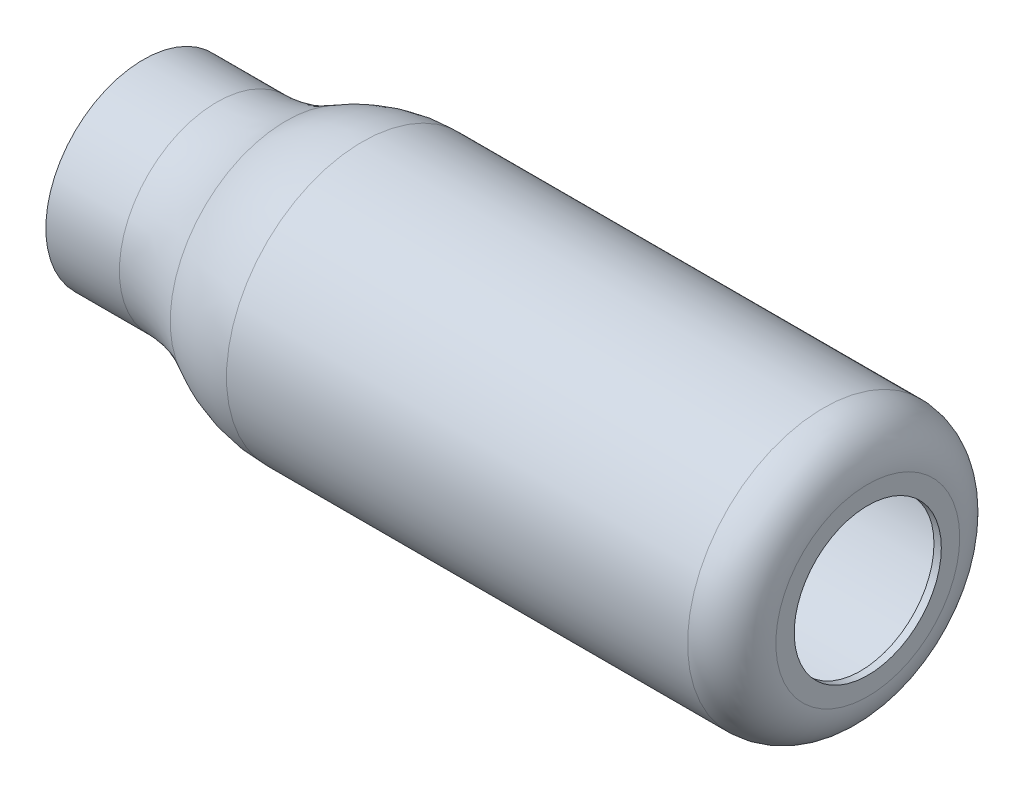
ISO-10303-21;
HEADER;
FILE_DESCRIPTION(('STEP AP214'),'2;1');
FILE_NAME('part.step','',(''),(''),'','','');
FILE_SCHEMA(('AUTOMOTIVE_DESIGN { 1 0 10303 214 1 1 1 1 }'));
ENDSEC;
DATA;
#1=APPLICATION_CONTEXT('core data for automotive mechanical design processes');
#2=APPLICATION_PROTOCOL_DEFINITION('international standard','automotive_design',2000,#1);
#3=PRODUCT_CONTEXT('',#1,'mechanical');
#4=PRODUCT('Part','Part','',(#3));
#5=PRODUCT_RELATED_PRODUCT_CATEGORY('part','',(#4));
#6=PRODUCT_DEFINITION_FORMATION('','',#4);
#7=PRODUCT_DEFINITION_CONTEXT('part definition',#1,'design');
#8=PRODUCT_DEFINITION('design','',#6,#7);
#9=PRODUCT_DEFINITION_SHAPE('','',#8);
#10=(LENGTH_UNIT() NAMED_UNIT(*) SI_UNIT(.MILLI.,.METRE.));
#11=(NAMED_UNIT(*) PLANE_ANGLE_UNIT() SI_UNIT($,.RADIAN.));
#12=(NAMED_UNIT(*) SI_UNIT($,.STERADIAN.) SOLID_ANGLE_UNIT());
#13=UNCERTAINTY_MEASURE_WITH_UNIT(LENGTH_MEASURE(1.E-05),#10,'distance_accuracy_value','');
#14=(GEOMETRIC_REPRESENTATION_CONTEXT(3) GLOBAL_UNCERTAINTY_ASSIGNED_CONTEXT((#13)) GLOBAL_UNIT_ASSIGNED_CONTEXT((#10,
#11,#12)) REPRESENTATION_CONTEXT('',''));
#15=CARTESIAN_POINT('',(0.,0.,0.));
#16=DIRECTION('',(0.,0.,1.));
#17=DIRECTION('',(1.,0.,0.));
#18=AXIS2_PLACEMENT_3D('',#15,#16,#17);
#19=CARTESIAN_POINT('',(0.,0.,0.));
#20=DIRECTION('',(1.,0.,0.));
#21=DIRECTION('',(0.,0.,-1.));
#22=AXIS2_PLACEMENT_3D('',#19,#20,#21);
#23=CYLINDRICAL_SURFACE('',#22,16.8275);
#24=CARTESIAN_POINT('',(-123.825,0.,0.));
#25=DIRECTION('',(1.,0.,0.));
#26=DIRECTION('',(0.,0.,-1.));
#27=AXIS2_PLACEMENT_3D('',#24,#25,#26);
#28=CIRCLE('',#27,16.8275);
#29=CARTESIAN_POINT('',(-123.825,0.,-16.8275));
#30=VERTEX_POINT('',#29);
#31=EDGE_CURVE('E76',#30,#30,#28,.T.);
#32=ORIENTED_EDGE('',*,*,#31,.T.);
#33=EDGE_LOOP('',(#32));
#34=FACE_BOUND('',#33,.T.);
#35=CARTESIAN_POINT('',(-111.125,0.,0.));
#36=DIRECTION('',(1.,0.,0.));
#37=DIRECTION('',(0.,0.,-1.));
#38=AXIS2_PLACEMENT_3D('',#35,#36,#37);
#39=CIRCLE('',#38,16.8275);
#40=CARTESIAN_POINT('',(-111.125,0.,-16.8275));
#41=VERTEX_POINT('',#40);
#42=EDGE_CURVE('E10',#41,#41,#39,.T.);
#43=ORIENTED_EDGE('',*,*,#42,.F.);
#44=EDGE_LOOP('',(#43));
#45=FACE_BOUND('',#44,.T.);
#46=ADVANCED_FACE('F30',(#34,#45),#23,.T.);
#47=CARTESIAN_POINT('',(-111.125,0.,0.));
#48=DIRECTION('',(1.,0.,0.));
#49=DIRECTION('',(0.,0.,-1.));
#50=AXIS2_PLACEMENT_3D('',#47,#48,#49);
#51=TOROIDAL_SURFACE('',#50,40.9575,24.13);
#52=ORIENTED_EDGE('',*,*,#42,.T.);
#53=EDGE_LOOP('',(#52));
#54=FACE_BOUND('',#53,.T.);
#55=CARTESIAN_POINT('',(-99.1745961837646,0.,0.));
#56=DIRECTION('',(1.,0.,0.));
#57=DIRECTION('',(0.,0.,-1.));
#58=AXIS2_PLACEMENT_3D('',#55,#56,#57);
#59=CIRCLE('',#58,19.9945625);
#60=CARTESIAN_POINT('',(-99.1745961837646,0.,-19.9945625));
#61=VERTEX_POINT('',#60);
#62=EDGE_CURVE('E36',#61,#61,#59,.T.);
#63=ORIENTED_EDGE('',*,*,#62,.F.);
#64=EDGE_LOOP('',(#63));
#65=FACE_BOUND('',#64,.T.);
#66=ADVANCED_FACE('F142',(#54,#65),#51,.F.);
#67=CARTESIAN_POINT('',(-85.9662551237149,0.,0.));
#68=DIRECTION('',(1.,0.,0.));
#69=DIRECTION('',(0.,0.,-1.));
#70=AXIS2_PLACEMENT_3D('',#67,#68,#69);
#71=DEGENERATE_TOROIDAL_SURFACE('',#70,3.17500000000001,26.67,.F.);
#72=ORIENTED_EDGE('',*,*,#62,.T.);
#73=EDGE_LOOP('',(#72));
#74=FACE_BOUND('',#73,.T.);
#75=CARTESIAN_POINT('',(-85.9662551237149,0.,0.));
#76=DIRECTION('',(1.,0.,0.));
#77=DIRECTION('',(0.,0.,-1.));
#78=AXIS2_PLACEMENT_3D('',#75,#76,#77);
#79=CIRCLE('',#78,23.495);
#80=CARTESIAN_POINT('',(-85.9662551237149,0.,-23.495));
#81=VERTEX_POINT('',#80);
#82=EDGE_CURVE('E40',#81,#81,#79,.T.);
#83=ORIENTED_EDGE('',*,*,#82,.F.);
#84=EDGE_LOOP('',(#83));
#85=FACE_BOUND('',#84,.T.);
#86=ADVANCED_FACE('F146',(#74,#85),#71,.F.);
#87=CARTESIAN_POINT('',(0.,0.,0.));
#88=DIRECTION('',(1.,0.,0.));
#89=DIRECTION('',(0.,0.,-1.));
#90=AXIS2_PLACEMENT_3D('',#87,#88,#89);
#91=CYLINDRICAL_SURFACE('',#90,23.495);
#92=ORIENTED_EDGE('',*,*,#82,.T.);
#93=EDGE_LOOP('',(#92));
#94=FACE_BOUND('',#93,.T.);
#95=CARTESIAN_POINT('',(-6.35,0.,0.));
#96=DIRECTION('',(1.,0.,0.));
#97=DIRECTION('',(0.,0.,-1.));
#98=AXIS2_PLACEMENT_3D('',#95,#96,#97);
#99=CIRCLE('',#98,23.495);
#100=CARTESIAN_POINT('',(-6.35,0.,-23.495));
#101=VERTEX_POINT('',#100);
#102=EDGE_CURVE('E44',#101,#101,#99,.T.);
#103=ORIENTED_EDGE('',*,*,#102,.F.);
#104=EDGE_LOOP('',(#103));
#105=FACE_BOUND('',#104,.T.);
#106=ADVANCED_FACE('F138',(#94,#105),#91,.T.);
#107=CARTESIAN_POINT('',(-6.35,0.,0.));
#108=DIRECTION('',(1.,0.,0.));
#109=DIRECTION('',(0.,0.,-1.));
#110=AXIS2_PLACEMENT_3D('',#107,#108,#109);
#111=TOROIDAL_SURFACE('',#110,15.875,7.62);
#112=ORIENTED_EDGE('',*,*,#102,.T.);
#113=EDGE_LOOP('',(#112));
#114=FACE_BOUND('',#113,.T.);
#115=CARTESIAN_POINT('',(1.27,0.,0.));
#116=DIRECTION('',(1.,0.,0.));
#117=DIRECTION('',(0.,0.,-1.));
#118=AXIS2_PLACEMENT_3D('',#115,#116,#117);
#119=CIRCLE('',#118,15.875);
#120=CARTESIAN_POINT('',(1.27,0.,-15.875));
#121=VERTEX_POINT('',#120);
#122=EDGE_CURVE('E49',#121,#121,#119,.T.);
#123=ORIENTED_EDGE('',*,*,#122,.F.);
#124=EDGE_LOOP('',(#123));
#125=FACE_BOUND('',#124,.T.);
#126=ADVANCED_FACE('F132',(#114,#125),#111,.T.);
#127=CARTESIAN_POINT('',(1.27,12.7,0.));
#128=DIRECTION('',(1.,0.,0.));
#129=DIRECTION('',(0.,0.,-1.));
#130=AXIS2_PLACEMENT_3D('',#127,#128,#129);
#131=PLANE('',#130);
#132=ORIENTED_EDGE('',*,*,#122,.T.);
#133=EDGE_LOOP('',(#132));
#134=FACE_BOUND('',#133,.T.);
#135=CARTESIAN_POINT('',(1.27,0.,0.));
#136=DIRECTION('',(1.,0.,0.));
#137=DIRECTION('',(0.,0.,-1.));
#138=AXIS2_PLACEMENT_3D('',#135,#136,#137);
#139=CIRCLE('',#138,12.7);
#140=CARTESIAN_POINT('',(1.27,0.,-12.7));
#141=VERTEX_POINT('',#140);
#142=EDGE_CURVE('E52',#141,#141,#139,.T.);
#143=ORIENTED_EDGE('',*,*,#142,.F.);
#144=EDGE_LOOP('',(#143));
#145=FACE_BOUND('',#144,.T.);
#146=ADVANCED_FACE('F127',(#134,#145),#131,.T.);
#147=CARTESIAN_POINT('',(0.,0.,0.));
#148=DIRECTION('',(1.,0.,0.));
#149=DIRECTION('',(0.,0.,-1.));
#150=AXIS2_PLACEMENT_3D('',#147,#148,#149);
#151=CYLINDRICAL_SURFACE('',#150,12.7);
#152=CARTESIAN_POINT('',(0.,0.,0.));
#153=DIRECTION('',(1.,0.,0.));
#154=DIRECTION('',(0.,0.,-1.));
#155=AXIS2_PLACEMENT_3D('',#152,#153,#154);
#156=CIRCLE('',#155,12.7);
#157=CARTESIAN_POINT('',(0.,0.,-12.7));
#158=VERTEX_POINT('',#157);
#159=EDGE_CURVE('E55',#158,#158,#156,.T.);
#160=ORIENTED_EDGE('',*,*,#159,.F.);
#161=EDGE_LOOP('',(#160));
#162=FACE_BOUND('',#161,.T.);
#163=ORIENTED_EDGE('',*,*,#142,.T.);
#164=EDGE_LOOP('',(#163));
#165=FACE_BOUND('',#164,.T.);
#166=ADVANCED_FACE('F121',(#162,#165),#151,.F.);
#167=CARTESIAN_POINT('',(0.,12.7,0.));
#168=DIRECTION('',(1.,0.,0.));
#169=DIRECTION('',(0.,0.,-1.));
#170=AXIS2_PLACEMENT_3D('',#167,#168,#169);
#171=PLANE('',#170);
#172=CARTESIAN_POINT('',(0.,0.,0.));
#173=DIRECTION('',(1.,0.,0.));
#174=DIRECTION('',(0.,0.,-1.));
#175=AXIS2_PLACEMENT_3D('',#172,#173,#174);
#176=CIRCLE('',#175,15.875);
#177=CARTESIAN_POINT('',(0.,0.,-15.875));
#178=VERTEX_POINT('',#177);
#179=EDGE_CURVE('E58',#178,#178,#176,.T.);
#180=ORIENTED_EDGE('',*,*,#179,.F.);
#181=EDGE_LOOP('',(#180));
#182=FACE_BOUND('',#181,.T.);
#183=ORIENTED_EDGE('',*,*,#159,.T.);
#184=EDGE_LOOP('',(#183));
#185=FACE_BOUND('',#184,.T.);
#186=ADVANCED_FACE('F115',(#182,#185),#171,.F.);
#187=CARTESIAN_POINT('',(-6.35,0.,0.));
#188=DIRECTION('',(1.,0.,0.));
#189=DIRECTION('',(0.,0.,-1.));
#190=AXIS2_PLACEMENT_3D('',#187,#188,#189);
#191=TOROIDAL_SURFACE('',#190,15.875,6.35);
#192=CARTESIAN_POINT('',(-6.35,0.,0.));
#193=DIRECTION('',(1.,0.,0.));
#194=DIRECTION('',(0.,0.,-1.));
#195=AXIS2_PLACEMENT_3D('',#192,#193,#194);
#196=CIRCLE('',#195,22.225);
#197=CARTESIAN_POINT('',(-6.35,0.,-22.225));
#198=VERTEX_POINT('',#197);
#199=EDGE_CURVE('E61',#198,#198,#196,.T.);
#200=ORIENTED_EDGE('',*,*,#199,.F.);
#201=EDGE_LOOP('',(#200));
#202=FACE_BOUND('',#201,.T.);
#203=ORIENTED_EDGE('',*,*,#179,.T.);
#204=EDGE_LOOP('',(#203));
#205=FACE_BOUND('',#204,.T.);
#206=ADVANCED_FACE('F109',(#202,#205),#191,.F.);
#207=CARTESIAN_POINT('',(0.,0.,0.));
#208=DIRECTION('',(1.,0.,0.));
#209=DIRECTION('',(0.,0.,-1.));
#210=AXIS2_PLACEMENT_3D('',#207,#208,#209);
#211=CYLINDRICAL_SURFACE('',#210,22.225);
#212=CARTESIAN_POINT('',(-85.9662551237149,0.,0.));
#213=DIRECTION('',(1.,0.,0.));
#214=DIRECTION('',(0.,0.,-1.));
#215=AXIS2_PLACEMENT_3D('',#212,#213,#214);
#216=CIRCLE('',#215,22.225);
#217=CARTESIAN_POINT('',(-85.9662551237149,0.,-22.225));
#218=VERTEX_POINT('',#217);
#219=EDGE_CURVE('E64',#218,#218,#216,.T.);
#220=ORIENTED_EDGE('',*,*,#219,.F.);
#221=EDGE_LOOP('',(#220));
#222=FACE_BOUND('',#221,.T.);
#223=ORIENTED_EDGE('',*,*,#199,.T.);
#224=EDGE_LOOP('',(#223));
#225=FACE_BOUND('',#224,.T.);
#226=ADVANCED_FACE('F103',(#222,#225),#211,.F.);
#227=CARTESIAN_POINT('',(-85.9662551237149,0.,0.));
#228=DIRECTION('',(1.,0.,0.));
#229=DIRECTION('',(0.,0.,-1.));
#230=AXIS2_PLACEMENT_3D('',#227,#228,#229);
#231=DEGENERATE_TOROIDAL_SURFACE('',#230,3.17500000000001,25.4,.F.);
#232=CARTESIAN_POINT('',(-98.5456275618574,0.,0.));
#233=DIRECTION('',(1.,0.,0.));
#234=DIRECTION('',(0.,0.,-1.));
#235=AXIS2_PLACEMENT_3D('',#232,#233,#234);
#236=CIRCLE('',#235,18.89125);
#237=CARTESIAN_POINT('',(-98.5456275618574,0.,-18.89125));
#238=VERTEX_POINT('',#237);
#239=EDGE_CURVE('E67',#238,#238,#236,.T.);
#240=ORIENTED_EDGE('',*,*,#239,.F.);
#241=EDGE_LOOP('',(#240));
#242=FACE_BOUND('',#241,.T.);
#243=ORIENTED_EDGE('',*,*,#219,.T.);
#244=EDGE_LOOP('',(#243));
#245=FACE_BOUND('',#244,.T.);
#246=ADVANCED_FACE('F97',(#242,#245),#231,.T.);
#247=CARTESIAN_POINT('',(-111.125,0.,0.));
#248=DIRECTION('',(1.,0.,0.));
#249=DIRECTION('',(0.,0.,-1.));
#250=AXIS2_PLACEMENT_3D('',#247,#248,#249);
#251=TOROIDAL_SURFACE('',#250,40.9575,25.4);
#252=CARTESIAN_POINT('',(-111.125,0.,0.));
#253=DIRECTION('',(1.,0.,0.));
#254=DIRECTION('',(0.,0.,-1.));
#255=AXIS2_PLACEMENT_3D('',#252,#253,#254);
#256=CIRCLE('',#255,15.5575);
#257=CARTESIAN_POINT('',(-111.125,0.,-15.5575));
#258=VERTEX_POINT('',#257);
#259=EDGE_CURVE('E70',#258,#258,#256,.T.);
#260=ORIENTED_EDGE('',*,*,#259,.F.);
#261=EDGE_LOOP('',(#260));
#262=FACE_BOUND('',#261,.T.);
#263=ORIENTED_EDGE('',*,*,#239,.T.);
#264=EDGE_LOOP('',(#263));
#265=FACE_BOUND('',#264,.T.);
#266=ADVANCED_FACE('F91',(#262,#265),#251,.T.);
#267=CARTESIAN_POINT('',(0.,0.,0.));
#268=DIRECTION('',(1.,0.,0.));
#269=DIRECTION('',(0.,0.,-1.));
#270=AXIS2_PLACEMENT_3D('',#267,#268,#269);
#271=CYLINDRICAL_SURFACE('',#270,15.5575);
#272=CARTESIAN_POINT('',(-123.825,0.,0.));
#273=DIRECTION('',(1.,0.,0.));
#274=DIRECTION('',(0.,0.,-1.));
#275=AXIS2_PLACEMENT_3D('',#272,#273,#274);
#276=CIRCLE('',#275,15.5575);
#277=CARTESIAN_POINT('',(-123.825,0.,-15.5575));
#278=VERTEX_POINT('',#277);
#279=EDGE_CURVE('E73',#278,#278,#276,.T.);
#280=ORIENTED_EDGE('',*,*,#279,.F.);
#281=EDGE_LOOP('',(#280));
#282=FACE_BOUND('',#281,.T.);
#283=ORIENTED_EDGE('',*,*,#259,.T.);
#284=EDGE_LOOP('',(#283));
#285=FACE_BOUND('',#284,.T.);
#286=ADVANCED_FACE('F85',(#282,#285),#271,.F.);
#287=CARTESIAN_POINT('',(-123.825,15.5575,0.));
#288=DIRECTION('',(1.,0.,0.));
#289=DIRECTION('',(0.,0.,-1.));
#290=AXIS2_PLACEMENT_3D('',#287,#288,#289);
#291=PLANE('',#290);
#292=ORIENTED_EDGE('',*,*,#31,.F.);
#293=EDGE_LOOP('',(#292));
#294=FACE_BOUND('',#293,.T.);
#295=ORIENTED_EDGE('',*,*,#279,.T.);
#296=EDGE_LOOP('',(#295));
#297=FACE_BOUND('',#296,.T.);
#298=ADVANCED_FACE('F82',(#294,#297),#291,.F.);
#299=CLOSED_SHELL('',(#46,#66,#86,#106,#126,#146,#166,#186,#206,#226,#246,#266,#286,#298));
#300=MANIFOLD_SOLID_BREP('B2',#299);
#301=ADVANCED_BREP_SHAPE_REPRESENTATION('',(#18,#300),#14);
#302=SHAPE_DEFINITION_REPRESENTATION(#9,#301);
ENDSEC;
END-ISO-10303-21;
